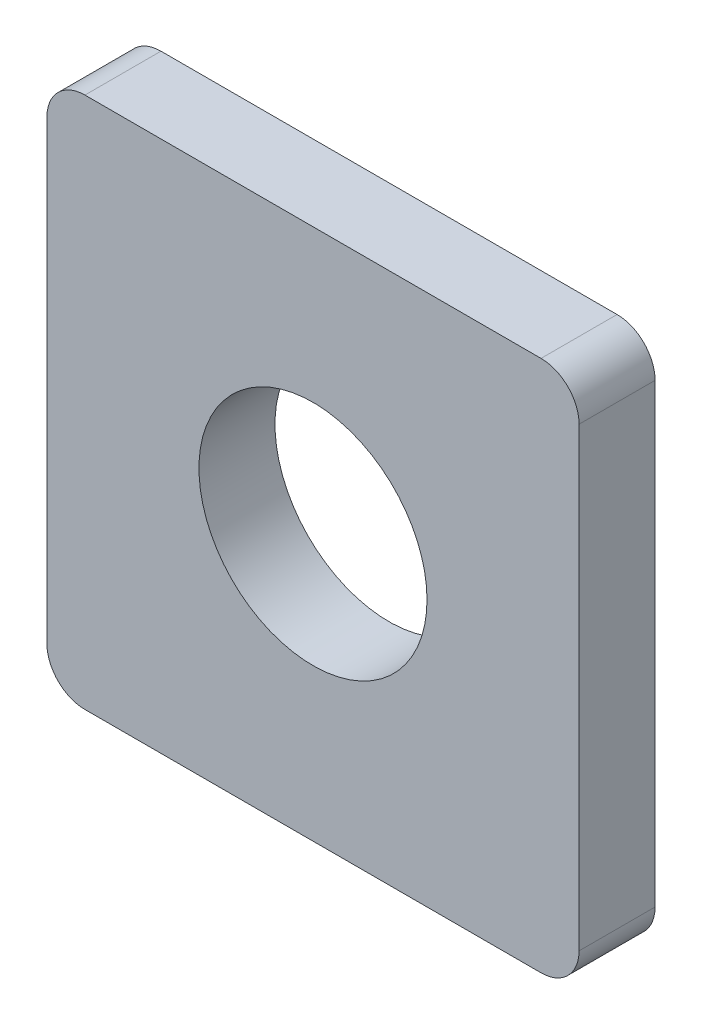
ISO-10303-21;
HEADER;
FILE_DESCRIPTION(('STEP AP214'),'2;1');
FILE_NAME('part.step','',(''),(''),'','','');
FILE_SCHEMA(('AUTOMOTIVE_DESIGN { 1 0 10303 214 1 1 1 1 }'));
ENDSEC;
DATA;
#1=APPLICATION_CONTEXT('core data for automotive mechanical design processes');
#2=APPLICATION_PROTOCOL_DEFINITION('international standard','automotive_design',2000,#1);
#3=PRODUCT_CONTEXT('',#1,'mechanical');
#4=PRODUCT('Part','Part','',(#3));
#5=PRODUCT_RELATED_PRODUCT_CATEGORY('part','',(#4));
#6=PRODUCT_DEFINITION_FORMATION('','',#4);
#7=PRODUCT_DEFINITION_CONTEXT('part definition',#1,'design');
#8=PRODUCT_DEFINITION('design','',#6,#7);
#9=PRODUCT_DEFINITION_SHAPE('','',#8);
#10=(LENGTH_UNIT() NAMED_UNIT(*) SI_UNIT(.MILLI.,.METRE.));
#11=(NAMED_UNIT(*) PLANE_ANGLE_UNIT() SI_UNIT($,.RADIAN.));
#12=(NAMED_UNIT(*) SI_UNIT($,.STERADIAN.) SOLID_ANGLE_UNIT());
#13=UNCERTAINTY_MEASURE_WITH_UNIT(LENGTH_MEASURE(1.E-05),#10,'distance_accuracy_value','');
#14=(GEOMETRIC_REPRESENTATION_CONTEXT(3) GLOBAL_UNCERTAINTY_ASSIGNED_CONTEXT((#13)) GLOBAL_UNIT_ASSIGNED_CONTEXT((#10,
#11,#12)) REPRESENTATION_CONTEXT('',''));
#15=CARTESIAN_POINT('',(0.,0.,0.));
#16=DIRECTION('',(0.,0.,1.));
#17=DIRECTION('',(1.,0.,0.));
#18=AXIS2_PLACEMENT_3D('',#15,#16,#17);
#19=CARTESIAN_POINT('',(92.5000001639128,11.5000002980232,18.1));
#20=DIRECTION('',(0.,0.,1.));
#21=DIRECTION('',(1.,0.,0.));
#22=AXIS2_PLACEMENT_3D('',#19,#20,#21);
#23=PLANE('',#22);
#24=CARTESIAN_POINT('',(92.5000001639128,11.5000002980232,18.1));
#25=DIRECTION('',(0.,0.,1.));
#26=DIRECTION('',(1.,0.,0.));
#27=AXIS2_PLACEMENT_3D('',#24,#25,#26);
#28=CIRCLE('',#27,1.5);
#29=CARTESIAN_POINT('',(94.0000001639128,11.5000002980232,18.1));
#30=VERTEX_POINT('',#29);
#31=EDGE_CURVE('E129',#30,#30,#28,.F.);
#32=ORIENTED_EDGE('',*,*,#31,.T.);
#33=EDGE_LOOP('',(#32));
#34=FACE_BOUND('',#33,.T.);
#35=CARTESIAN_POINT('',(89.5000001639128,8.50000029802322,18.1));
#36=DIRECTION('',(0.,0.,1.));
#37=DIRECTION('',(1.,0.,0.));
#38=AXIS2_PLACEMENT_3D('',#35,#36,#37);
#39=CIRCLE('',#38,0.5);
#40=CARTESIAN_POINT('',(89.5000001639128,8.00000029802322,18.1));
#41=VERTEX_POINT('',#40);
#42=CARTESIAN_POINT('',(89.0000001639128,8.50000029802322,18.1));
#43=VERTEX_POINT('',#42);
#44=EDGE_CURVE('E113',#41,#43,#39,.F.);
#45=ORIENTED_EDGE('',*,*,#44,.F.);
#46=DIRECTION('',(1.,0.,0.));
#47=VECTOR('',#46,1.);
#48=CARTESIAN_POINT('',(89.0000001639128,8.00000029802322,18.1));
#49=LINE('',#48,#47);
#50=CARTESIAN_POINT('',(95.5000001639128,8.00000029802322,18.1));
#51=VERTEX_POINT('',#50);
#52=EDGE_CURVE('E106',#51,#41,#49,.F.);
#53=ORIENTED_EDGE('',*,*,#52,.F.);
#54=CARTESIAN_POINT('',(95.5000001639128,8.50000029802322,18.1));
#55=DIRECTION('',(0.,0.,1.));
#56=DIRECTION('',(1.,0.,0.));
#57=AXIS2_PLACEMENT_3D('',#54,#55,#56);
#58=CIRCLE('',#57,0.5);
#59=CARTESIAN_POINT('',(96.0000001639128,8.50000029802322,18.1));
#60=VERTEX_POINT('',#59);
#61=EDGE_CURVE('E93',#60,#51,#58,.F.);
#62=ORIENTED_EDGE('',*,*,#61,.F.);
#63=DIRECTION('',(0.,1.,0.));
#64=VECTOR('',#63,1.);
#65=CARTESIAN_POINT('',(96.0000001639128,8.00000029802322,18.1));
#66=LINE('',#65,#64);
#67=CARTESIAN_POINT('',(96.0000001639128,14.5000002980232,18.1));
#68=VERTEX_POINT('',#67);
#69=EDGE_CURVE('E89',#68,#60,#66,.F.);
#70=ORIENTED_EDGE('',*,*,#69,.F.);
#71=CARTESIAN_POINT('',(95.5000001639128,14.5000002980232,18.1));
#72=DIRECTION('',(0.,0.,1.));
#73=DIRECTION('',(1.,0.,0.));
#74=AXIS2_PLACEMENT_3D('',#71,#72,#73);
#75=CIRCLE('',#74,0.5);
#76=CARTESIAN_POINT('',(95.5000001639128,15.0000002980232,18.1));
#77=VERTEX_POINT('',#76);
#78=EDGE_CURVE('E20',#77,#68,#75,.F.);
#79=ORIENTED_EDGE('',*,*,#78,.F.);
#80=DIRECTION('',(1.,0.,0.));
#81=VECTOR('',#80,1.);
#82=CARTESIAN_POINT('',(96.0000001639128,15.0000002980232,18.1));
#83=LINE('',#82,#81);
#84=CARTESIAN_POINT('',(89.5000001639128,15.0000002980232,18.1));
#85=VERTEX_POINT('',#84);
#86=EDGE_CURVE('E102',#85,#77,#83,.T.);
#87=ORIENTED_EDGE('',*,*,#86,.F.);
#88=CARTESIAN_POINT('',(89.5000001639128,14.5000002980232,18.1));
#89=DIRECTION('',(0.,0.,1.));
#90=DIRECTION('',(1.,0.,0.));
#91=AXIS2_PLACEMENT_3D('',#88,#89,#90);
#92=CIRCLE('',#91,0.5);
#93=CARTESIAN_POINT('',(89.0000001639128,14.5000002980232,18.1));
#94=VERTEX_POINT('',#93);
#95=EDGE_CURVE('E115',#94,#85,#92,.F.);
#96=ORIENTED_EDGE('',*,*,#95,.F.);
#97=DIRECTION('',(0.,1.,0.));
#98=VECTOR('',#97,1.);
#99=CARTESIAN_POINT('',(89.0000001639128,15.0000002980232,18.1));
#100=LINE('',#99,#98);
#101=EDGE_CURVE('E110',#43,#94,#100,.T.);
#102=ORIENTED_EDGE('',*,*,#101,.F.);
#103=EDGE_LOOP('',(#45,#53,#62,#70,#79,#87,#96,#102));
#104=FACE_BOUND('',#103,.T.);
#105=ADVANCED_FACE('F17',(#34,#104),#23,.T.);
#106=CARTESIAN_POINT('',(96.0000001639128,8.00000029802322,17.1));
#107=DIRECTION('',(1.,0.,0.));
#108=DIRECTION('',(0.,0.,-1.));
#109=AXIS2_PLACEMENT_3D('',#106,#107,#108);
#110=PLANE('',#109);
#111=DIRECTION('',(0.,0.,1.));
#112=VECTOR('',#111,1.);
#113=CARTESIAN_POINT('',(96.0000001639128,14.5000002980232,17.1));
#114=LINE('',#113,#112);
#115=CARTESIAN_POINT('',(96.0000001639128,14.5000002980232,17.1));
#116=VERTEX_POINT('',#115);
#117=EDGE_CURVE('E86',#68,#116,#114,.F.);
#118=ORIENTED_EDGE('',*,*,#117,.F.);
#119=ORIENTED_EDGE('',*,*,#69,.T.);
#120=DIRECTION('',(0.,0.,1.));
#121=VECTOR('',#120,1.);
#122=CARTESIAN_POINT('',(96.0000001639128,8.50000029802322,17.1));
#123=LINE('',#122,#121);
#124=CARTESIAN_POINT('',(96.0000001639128,8.50000029802322,17.1));
#125=VERTEX_POINT('',#124);
#126=EDGE_CURVE('E132',#125,#60,#123,.T.);
#127=ORIENTED_EDGE('',*,*,#126,.F.);
#128=DIRECTION('',(0.,1.,0.));
#129=VECTOR('',#128,1.);
#130=CARTESIAN_POINT('',(96.0000001639128,11.5000002980232,17.1));
#131=LINE('',#130,#129);
#132=EDGE_CURVE('E100',#125,#116,#131,.T.);
#133=ORIENTED_EDGE('',*,*,#132,.T.);
#134=EDGE_LOOP('',(#118,#119,#127,#133));
#135=FACE_BOUND('',#134,.T.);
#136=ADVANCED_FACE('F99',(#135),#110,.T.);
#137=CARTESIAN_POINT('',(95.5000001639128,14.5000002980232,17.1));
#138=DIRECTION('',(0.,0.,1.));
#139=DIRECTION('',(1.,0.,0.));
#140=AXIS2_PLACEMENT_3D('',#137,#138,#139);
#141=CYLINDRICAL_SURFACE('',#140,0.5);
#142=CARTESIAN_POINT('',(95.5000001639128,14.5000002980232,17.1));
#143=DIRECTION('',(0.,0.,1.));
#144=DIRECTION('',(1.,0.,0.));
#145=AXIS2_PLACEMENT_3D('',#142,#143,#144);
#146=CIRCLE('',#145,0.5);
#147=CARTESIAN_POINT('',(95.5000001639128,15.0000002980232,17.1));
#148=VERTEX_POINT('',#147);
#149=EDGE_CURVE('E127',#116,#148,#146,.T.);
#150=ORIENTED_EDGE('',*,*,#149,.T.);
#151=DIRECTION('',(0.,0.,1.));
#152=VECTOR('',#151,1.);
#153=CARTESIAN_POINT('',(95.5000001639128,15.0000002980232,17.1));
#154=LINE('',#153,#152);
#155=EDGE_CURVE('E88',#77,#148,#154,.F.);
#156=ORIENTED_EDGE('',*,*,#155,.F.);
#157=ORIENTED_EDGE('',*,*,#78,.T.);
#158=ORIENTED_EDGE('',*,*,#117,.T.);
#159=EDGE_LOOP('',(#150,#156,#157,#158));
#160=FACE_BOUND('',#159,.T.);
#161=ADVANCED_FACE('F84',(#160),#141,.T.);
#162=CARTESIAN_POINT('',(96.0000001639128,15.0000002980232,17.1));
#163=DIRECTION('',(0.,1.,0.));
#164=DIRECTION('',(0.,0.,1.));
#165=AXIS2_PLACEMENT_3D('',#162,#163,#164);
#166=PLANE('',#165);
#167=DIRECTION('',(0.,0.,1.));
#168=VECTOR('',#167,1.);
#169=CARTESIAN_POINT('',(89.5000001639128,15.0000002980232,17.1));
#170=LINE('',#169,#168);
#171=CARTESIAN_POINT('',(89.5000001639128,15.0000002980232,17.1));
#172=VERTEX_POINT('',#171);
#173=EDGE_CURVE('E134',#85,#172,#170,.F.);
#174=ORIENTED_EDGE('',*,*,#173,.F.);
#175=ORIENTED_EDGE('',*,*,#86,.T.);
#176=ORIENTED_EDGE('',*,*,#155,.T.);
#177=DIRECTION('',(1.,0.,0.));
#178=VECTOR('',#177,1.);
#179=CARTESIAN_POINT('',(92.5000001639128,15.0000002980232,17.1));
#180=LINE('',#179,#178);
#181=EDGE_CURVE('E126',#148,#172,#180,.F.);
#182=ORIENTED_EDGE('',*,*,#181,.T.);
#183=EDGE_LOOP('',(#174,#175,#176,#182));
#184=FACE_BOUND('',#183,.T.);
#185=ADVANCED_FACE('F168',(#184),#166,.T.);
#186=CARTESIAN_POINT('',(89.5000001639128,14.5000002980232,17.1));
#187=DIRECTION('',(0.,0.,1.));
#188=DIRECTION('',(1.,0.,0.));
#189=AXIS2_PLACEMENT_3D('',#186,#187,#188);
#190=CYLINDRICAL_SURFACE('',#189,0.5);
#191=CARTESIAN_POINT('',(89.5000001639128,14.5000002980232,17.1));
#192=DIRECTION('',(0.,0.,1.));
#193=DIRECTION('',(1.,0.,0.));
#194=AXIS2_PLACEMENT_3D('',#191,#192,#193);
#195=CIRCLE('',#194,0.5);
#196=CARTESIAN_POINT('',(89.0000001639128,14.5000002980232,17.1));
#197=VERTEX_POINT('',#196);
#198=EDGE_CURVE('E123',#172,#197,#195,.T.);
#199=ORIENTED_EDGE('',*,*,#198,.T.);
#200=DIRECTION('',(0.,0.,1.));
#201=VECTOR('',#200,1.);
#202=CARTESIAN_POINT('',(89.0000001639128,14.5000002980232,17.1));
#203=LINE('',#202,#201);
#204=EDGE_CURVE('E114',#94,#197,#203,.F.);
#205=ORIENTED_EDGE('',*,*,#204,.F.);
#206=ORIENTED_EDGE('',*,*,#95,.T.);
#207=ORIENTED_EDGE('',*,*,#173,.T.);
#208=EDGE_LOOP('',(#199,#205,#206,#207));
#209=FACE_BOUND('',#208,.T.);
#210=ADVANCED_FACE('F166',(#209),#190,.T.);
#211=CARTESIAN_POINT('',(89.0000001639128,15.0000002980232,17.1));
#212=DIRECTION('',(-1.,0.,0.));
#213=DIRECTION('',(0.,0.,1.));
#214=AXIS2_PLACEMENT_3D('',#211,#212,#213);
#215=PLANE('',#214);
#216=DIRECTION('',(0.,0.,1.));
#217=VECTOR('',#216,1.);
#218=CARTESIAN_POINT('',(89.0000001639128,8.50000029802322,17.1));
#219=LINE('',#218,#217);
#220=CARTESIAN_POINT('',(89.0000001639128,8.50000029802322,17.1));
#221=VERTEX_POINT('',#220);
#222=EDGE_CURVE('E109',#43,#221,#219,.F.);
#223=ORIENTED_EDGE('',*,*,#222,.F.);
#224=ORIENTED_EDGE('',*,*,#101,.T.);
#225=ORIENTED_EDGE('',*,*,#204,.T.);
#226=DIRECTION('',(0.,1.,0.));
#227=VECTOR('',#226,1.);
#228=CARTESIAN_POINT('',(89.0000001639128,11.5000002980232,17.1));
#229=LINE('',#228,#227);
#230=EDGE_CURVE('E122',#197,#221,#229,.F.);
#231=ORIENTED_EDGE('',*,*,#230,.T.);
#232=EDGE_LOOP('',(#223,#224,#225,#231));
#233=FACE_BOUND('',#232,.T.);
#234=ADVANCED_FACE('F164',(#233),#215,.T.);
#235=CARTESIAN_POINT('',(89.5000001639128,8.50000029802322,17.1));
#236=DIRECTION('',(0.,0.,1.));
#237=DIRECTION('',(1.,0.,0.));
#238=AXIS2_PLACEMENT_3D('',#235,#236,#237);
#239=CYLINDRICAL_SURFACE('',#238,0.5);
#240=CARTESIAN_POINT('',(89.5000001639128,8.50000029802322,17.1));
#241=DIRECTION('',(0.,0.,1.));
#242=DIRECTION('',(1.,0.,0.));
#243=AXIS2_PLACEMENT_3D('',#240,#241,#242);
#244=CIRCLE('',#243,0.5);
#245=CARTESIAN_POINT('',(89.5000001639128,8.00000029802322,17.1));
#246=VERTEX_POINT('',#245);
#247=EDGE_CURVE('E119',#221,#246,#244,.T.);
#248=ORIENTED_EDGE('',*,*,#247,.T.);
#249=DIRECTION('',(0.,0.,-1.));
#250=VECTOR('',#249,1.);
#251=CARTESIAN_POINT('',(89.5000001639128,8.00000029802322,17.1));
#252=LINE('',#251,#250);
#253=EDGE_CURVE('E108',#41,#246,#252,.T.);
#254=ORIENTED_EDGE('',*,*,#253,.F.);
#255=ORIENTED_EDGE('',*,*,#44,.T.);
#256=ORIENTED_EDGE('',*,*,#222,.T.);
#257=EDGE_LOOP('',(#248,#254,#255,#256));
#258=FACE_BOUND('',#257,.T.);
#259=ADVANCED_FACE('F160',(#258),#239,.T.);
#260=CARTESIAN_POINT('',(89.0000001639128,8.00000029802322,17.1));
#261=DIRECTION('',(0.,-1.,0.));
#262=DIRECTION('',(0.,0.,-1.));
#263=AXIS2_PLACEMENT_3D('',#260,#261,#262);
#264=PLANE('',#263);
#265=ORIENTED_EDGE('',*,*,#253,.T.);
#266=DIRECTION('',(1.,0.,0.));
#267=VECTOR('',#266,1.);
#268=CARTESIAN_POINT('',(92.5000001639128,8.00000029802322,17.1));
#269=LINE('',#268,#267);
#270=CARTESIAN_POINT('',(95.5000001639128,8.00000029802322,17.1));
#271=VERTEX_POINT('',#270);
#272=EDGE_CURVE('E118',#246,#271,#269,.T.);
#273=ORIENTED_EDGE('',*,*,#272,.T.);
#274=DIRECTION('',(0.,0.,1.));
#275=VECTOR('',#274,1.);
#276=CARTESIAN_POINT('',(95.5000001639128,8.00000029802322,17.1));
#277=LINE('',#276,#275);
#278=EDGE_CURVE('E35',#51,#271,#277,.F.);
#279=ORIENTED_EDGE('',*,*,#278,.F.);
#280=ORIENTED_EDGE('',*,*,#52,.T.);
#281=EDGE_LOOP('',(#265,#273,#279,#280));
#282=FACE_BOUND('',#281,.T.);
#283=ADVANCED_FACE('F153',(#282),#264,.T.);
#284=CARTESIAN_POINT('',(95.5000001639128,8.50000029802322,17.1));
#285=DIRECTION('',(0.,0.,1.));
#286=DIRECTION('',(1.,0.,0.));
#287=AXIS2_PLACEMENT_3D('',#284,#285,#286);
#288=CYLINDRICAL_SURFACE('',#287,0.5);
#289=CARTESIAN_POINT('',(95.5000001639128,8.50000029802322,17.1));
#290=DIRECTION('',(0.,0.,1.));
#291=DIRECTION('',(1.,0.,0.));
#292=AXIS2_PLACEMENT_3D('',#289,#290,#291);
#293=CIRCLE('',#292,0.5);
#294=EDGE_CURVE('E26',#271,#125,#293,.T.);
#295=ORIENTED_EDGE('',*,*,#294,.T.);
#296=ORIENTED_EDGE('',*,*,#126,.T.);
#297=ORIENTED_EDGE('',*,*,#61,.T.);
#298=ORIENTED_EDGE('',*,*,#278,.T.);
#299=EDGE_LOOP('',(#295,#296,#297,#298));
#300=FACE_BOUND('',#299,.T.);
#301=ADVANCED_FACE('F185',(#300),#288,.T.);
#302=CARTESIAN_POINT('',(92.5000001639128,11.5000002980232,17.1));
#303=DIRECTION('',(0.,0.,1.));
#304=DIRECTION('',(1.,0.,0.));
#305=AXIS2_PLACEMENT_3D('',#302,#303,#304);
#306=CYLINDRICAL_SURFACE('',#305,1.5);
#307=CARTESIAN_POINT('',(92.5000001639128,11.5000002980232,17.1));
#308=DIRECTION('',(0.,0.,1.));
#309=DIRECTION('',(1.,0.,0.));
#310=AXIS2_PLACEMENT_3D('',#307,#308,#309);
#311=CIRCLE('',#310,1.5);
#312=CARTESIAN_POINT('',(94.0000001639128,11.5000002980232,17.1));
#313=VERTEX_POINT('',#312);
#314=EDGE_CURVE('E11',#313,#313,#311,.F.);
#315=ORIENTED_EDGE('',*,*,#314,.T.);
#316=EDGE_LOOP('',(#315));
#317=FACE_BOUND('',#316,.T.);
#318=ORIENTED_EDGE('',*,*,#31,.F.);
#319=EDGE_LOOP('',(#318));
#320=FACE_BOUND('',#319,.T.);
#321=ADVANCED_FACE('F179',(#317,#320),#306,.F.);
#322=CARTESIAN_POINT('',(92.5000001639128,11.5000002980232,17.1));
#323=DIRECTION('',(0.,0.,1.));
#324=DIRECTION('',(1.,0.,0.));
#325=AXIS2_PLACEMENT_3D('',#322,#323,#324);
#326=PLANE('',#325);
#327=ORIENTED_EDGE('',*,*,#314,.F.);
#328=EDGE_LOOP('',(#327));
#329=FACE_BOUND('',#328,.T.);
#330=ORIENTED_EDGE('',*,*,#272,.F.);
#331=ORIENTED_EDGE('',*,*,#247,.F.);
#332=ORIENTED_EDGE('',*,*,#230,.F.);
#333=ORIENTED_EDGE('',*,*,#198,.F.);
#334=ORIENTED_EDGE('',*,*,#181,.F.);
#335=ORIENTED_EDGE('',*,*,#149,.F.);
#336=ORIENTED_EDGE('',*,*,#132,.F.);
#337=ORIENTED_EDGE('',*,*,#294,.F.);
#338=EDGE_LOOP('',(#330,#331,#332,#333,#334,#335,#336,#337));
#339=FACE_BOUND('',#338,.T.);
#340=ADVANCED_FACE('F157',(#329,#339),#326,.F.);
#341=CLOSED_SHELL('',(#105,#136,#161,#185,#210,#234,#259,#283,#301,#321,#340));
#342=MANIFOLD_SOLID_BREP('B1',#341);
#343=ADVANCED_BREP_SHAPE_REPRESENTATION('',(#18,#342),#14);
#344=SHAPE_DEFINITION_REPRESENTATION(#9,#343);
ENDSEC;
END-ISO-10303-21;
